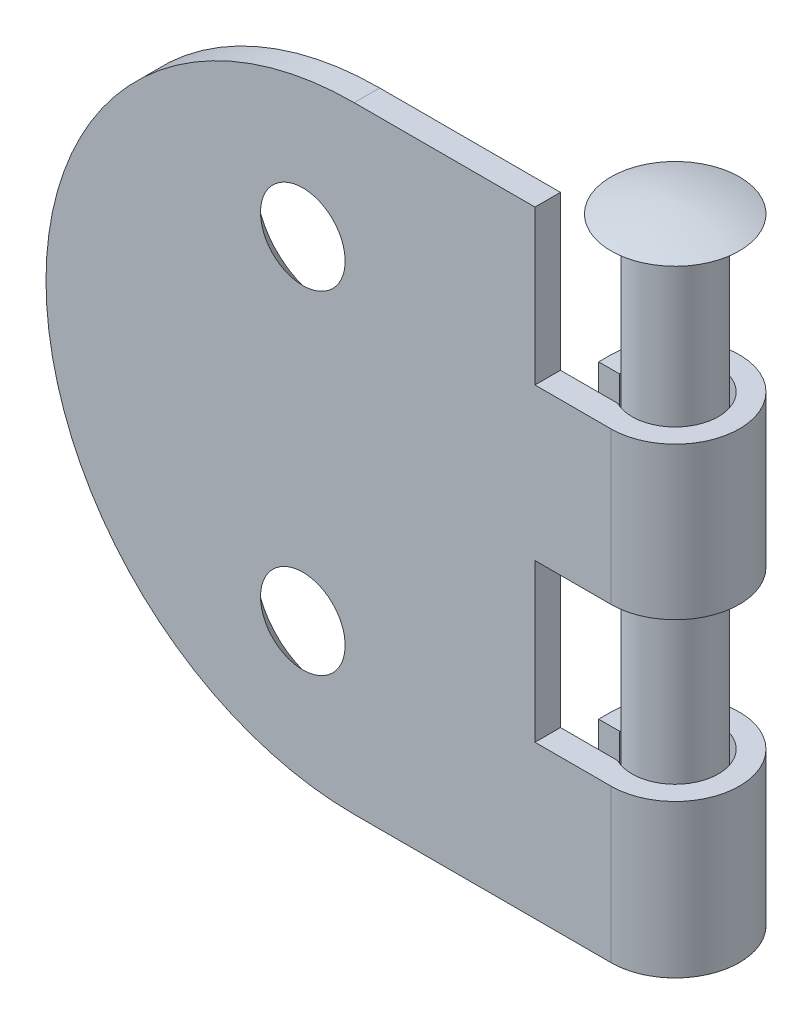
ISO-10303-21;
HEADER;
FILE_DESCRIPTION(('STEP AP214'),'2;1');
FILE_NAME('part.step','',(''),(''),'','','');
FILE_SCHEMA(('AUTOMOTIVE_DESIGN { 1 0 10303 214 1 1 1 1 }'));
ENDSEC;
DATA;
#1=APPLICATION_CONTEXT('core data for automotive mechanical design processes');
#2=APPLICATION_PROTOCOL_DEFINITION('international standard','automotive_design',2000,#1);
#3=PRODUCT_CONTEXT('',#1,'mechanical');
#4=PRODUCT('Part','Part','',(#3));
#5=PRODUCT_RELATED_PRODUCT_CATEGORY('part','',(#4));
#6=PRODUCT_DEFINITION_FORMATION('','',#4);
#7=PRODUCT_DEFINITION_CONTEXT('part definition',#1,'design');
#8=PRODUCT_DEFINITION('design','',#6,#7);
#9=PRODUCT_DEFINITION_SHAPE('','',#8);
#10=(LENGTH_UNIT() NAMED_UNIT(*) SI_UNIT(.MILLI.,.METRE.));
#11=(NAMED_UNIT(*) PLANE_ANGLE_UNIT() SI_UNIT($,.RADIAN.));
#12=(NAMED_UNIT(*) SI_UNIT($,.STERADIAN.) SOLID_ANGLE_UNIT());
#13=UNCERTAINTY_MEASURE_WITH_UNIT(LENGTH_MEASURE(1.E-05),#10,'distance_accuracy_value','');
#14=(GEOMETRIC_REPRESENTATION_CONTEXT(3) GLOBAL_UNCERTAINTY_ASSIGNED_CONTEXT((#13)) GLOBAL_UNIT_ASSIGNED_CONTEXT((#10,
#11,#12)) REPRESENTATION_CONTEXT('',''));
#15=CARTESIAN_POINT('',(0.,0.,0.));
#16=DIRECTION('',(0.,0.,1.));
#17=DIRECTION('',(1.,0.,0.));
#18=AXIS2_PLACEMENT_3D('',#15,#16,#17);
#19=CARTESIAN_POINT('',(-3.96875,21.2780334940602,0.));
#20=DIRECTION('',(1.,0.,0.));
#21=DIRECTION('',(0.,0.,-1.));
#22=AXIS2_PLACEMENT_3D('',#19,#20,#21);
#23=PLANE('',#22);
#24=DIRECTION('',(0.,0.,1.));
#25=VECTOR('',#24,1.);
#26=CARTESIAN_POINT('',(-3.96875,9.525,0.));
#27=LINE('',#26,#25);
#28=CARTESIAN_POINT('',(-3.96875,9.525,0.));
#29=VERTEX_POINT('',#28);
#30=CARTESIAN_POINT('',(-3.96875,9.525,0.762));
#31=VERTEX_POINT('',#30);
#32=EDGE_CURVE('E66',#29,#31,#27,.T.);
#33=ORIENTED_EDGE('',*,*,#32,.F.);
#34=DIRECTION('',(0.,-1.,0.));
#35=VECTOR('',#34,1.);
#36=CARTESIAN_POINT('',(-3.96875,21.2780334940602,0.));
#37=LINE('',#36,#35);
#38=CARTESIAN_POINT('',(-3.96875,0.127,0.));
#39=VERTEX_POINT('',#38);
#40=EDGE_CURVE('E75',#29,#39,#37,.T.);
#41=ORIENTED_EDGE('',*,*,#40,.T.);
#42=DIRECTION('',(0.,0.,1.));
#43=VECTOR('',#42,1.);
#44=CARTESIAN_POINT('',(-3.96875,0.127,0.));
#45=LINE('',#44,#43);
#46=CARTESIAN_POINT('',(-3.96875,0.127,0.762));
#47=VERTEX_POINT('',#46);
#48=EDGE_CURVE('E220',#39,#47,#45,.T.);
#49=ORIENTED_EDGE('',*,*,#48,.T.);
#50=DIRECTION('',(0.,-1.,0.));
#51=VECTOR('',#50,1.);
#52=CARTESIAN_POINT('',(-3.96875,21.2780334940602,0.762));
#53=LINE('',#52,#51);
#54=EDGE_CURVE('E203',#31,#47,#53,.T.);
#55=ORIENTED_EDGE('',*,*,#54,.F.);
#56=EDGE_LOOP('',(#33,#41,#49,#55));
#57=FACE_BOUND('',#56,.T.);
#58=ADVANCED_FACE('F56',(#57),#23,.F.);
#59=CARTESIAN_POINT('',(-2.667,21.2780334940602,0.762));
#60=DIRECTION('',(0.,0.,1.));
#61=DIRECTION('',(1.,0.,0.));
#62=AXIS2_PLACEMENT_3D('',#59,#60,#61);
#63=PLANE('',#62);
#64=DIRECTION('',(0.,-1.,0.));
#65=VECTOR('',#64,1.);
#66=CARTESIAN_POINT('',(-2.667,21.2780334940602,0.762));
#67=LINE('',#66,#65);
#68=CARTESIAN_POINT('',(-2.667,9.525,0.762));
#69=VERTEX_POINT('',#68);
#70=CARTESIAN_POINT('',(-2.667,0.127,0.762));
#71=VERTEX_POINT('',#70);
#72=EDGE_CURVE('E185',#69,#71,#67,.T.);
#73=ORIENTED_EDGE('',*,*,#72,.F.);
#74=DIRECTION('',(-1.,0.,0.));
#75=VECTOR('',#74,1.);
#76=CARTESIAN_POINT('',(-2.667,9.525,0.762));
#77=LINE('',#76,#75);
#78=EDGE_CURVE('E222',#69,#31,#77,.T.);
#79=ORIENTED_EDGE('',*,*,#78,.T.);
#80=ORIENTED_EDGE('',*,*,#54,.T.);
#81=DIRECTION('',(-1.,0.,0.));
#82=VECTOR('',#81,1.);
#83=CARTESIAN_POINT('',(-2.667,0.127,0.762));
#84=LINE('',#83,#82);
#85=EDGE_CURVE('E200',#71,#47,#84,.T.);
#86=ORIENTED_EDGE('',*,*,#85,.F.);
#87=EDGE_LOOP('',(#73,#79,#80,#86));
#88=FACE_BOUND('',#87,.T.);
#89=ADVANCED_FACE('F201',(#88),#63,.T.);
#90=CARTESIAN_POINT('',(-2.667,21.2780334940602,0.));
#91=DIRECTION('',(1.,0.,0.));
#92=DIRECTION('',(0.,0.,-1.));
#93=AXIS2_PLACEMENT_3D('',#90,#91,#92);
#94=PLANE('',#93);
#95=DIRECTION('',(0.,-1.,0.));
#96=VECTOR('',#95,1.);
#97=CARTESIAN_POINT('',(-2.667,21.2780334940602,0.));
#98=LINE('',#97,#96);
#99=CARTESIAN_POINT('',(-2.667,9.525,0.));
#100=VERTEX_POINT('',#99);
#101=CARTESIAN_POINT('',(-2.667,0.127,0.));
#102=VERTEX_POINT('',#101);
#103=EDGE_CURVE('E260',#100,#102,#98,.T.);
#104=ORIENTED_EDGE('',*,*,#103,.F.);
#105=DIRECTION('',(0.,0.,1.));
#106=VECTOR('',#105,1.);
#107=CARTESIAN_POINT('',(-2.667,9.525,0.));
#108=LINE('',#107,#106);
#109=EDGE_CURVE('E193',#100,#69,#108,.T.);
#110=ORIENTED_EDGE('',*,*,#109,.T.);
#111=ORIENTED_EDGE('',*,*,#72,.T.);
#112=DIRECTION('',(0.,0.,1.));
#113=VECTOR('',#112,1.);
#114=CARTESIAN_POINT('',(-2.667,0.127,0.));
#115=LINE('',#114,#113);
#116=EDGE_CURVE('E190',#102,#71,#115,.T.);
#117=ORIENTED_EDGE('',*,*,#116,.F.);
#118=EDGE_LOOP('',(#104,#110,#111,#117));
#119=FACE_BOUND('',#118,.T.);
#120=ADVANCED_FACE('F188',(#119),#94,.T.);
#121=CARTESIAN_POINT('',(0.,21.2780334940602,0.));
#122=DIRECTION('',(0.,-1.,0.));
#123=DIRECTION('',(0.,0.,-1.));
#124=AXIS2_PLACEMENT_3D('',#121,#122,#123);
#125=CYLINDRICAL_SURFACE('',#124,2.667);
#126=DIRECTION('',(0.,-1.,0.));
#127=VECTOR('',#126,1.);
#128=CARTESIAN_POINT('',(-1.17553919436997,21.2780334940602,2.39395));
#129=LINE('',#128,#127);
#130=CARTESIAN_POINT('',(-1.17553919436997,9.525,2.39395));
#131=VERTEX_POINT('',#130);
#132=CARTESIAN_POINT('',(-1.17553919436997,0.127,2.39395));
#133=VERTEX_POINT('',#132);
#134=EDGE_CURVE('E231',#131,#133,#129,.T.);
#135=ORIENTED_EDGE('',*,*,#134,.F.);
#136=CARTESIAN_POINT('',(0.,9.525,0.));
#137=DIRECTION('',(0.,1.,0.));
#138=DIRECTION('',(0.,0.,1.));
#139=AXIS2_PLACEMENT_3D('',#136,#137,#138);
#140=CIRCLE('',#139,2.667);
#141=EDGE_CURVE('E196',#131,#100,#140,.T.);
#142=ORIENTED_EDGE('',*,*,#141,.T.);
#143=ORIENTED_EDGE('',*,*,#103,.T.);
#144=CARTESIAN_POINT('',(0.,0.127,0.));
#145=DIRECTION('',(0.,1.,0.));
#146=DIRECTION('',(0.,0.,1.));
#147=AXIS2_PLACEMENT_3D('',#144,#145,#146);
#148=CIRCLE('',#147,2.667);
#149=EDGE_CURVE('E212',#133,#102,#148,.T.);
#150=ORIENTED_EDGE('',*,*,#149,.F.);
#151=EDGE_LOOP('',(#135,#142,#143,#150));
#152=FACE_BOUND('',#151,.T.);
#153=ADVANCED_FACE('F417',(#152),#125,.F.);
#154=CARTESIAN_POINT('',(0.,21.2780334940602,2.39395));
#155=DIRECTION('',(0.,0.,-1.));
#156=DIRECTION('',(-1.,0.,0.));
#157=AXIS2_PLACEMENT_3D('',#154,#155,#156);
#158=PLANE('',#157);
#159=CARTESIAN_POINT('',(-19.05,10.287,2.39395));
#160=DIRECTION('',(0.,0.,-1.));
#161=DIRECTION('',(-1.,0.,0.));
#162=AXIS2_PLACEMENT_3D('',#159,#160,#161);
#163=CIRCLE('',#162,4.49259581845785);
#164=CARTESIAN_POINT('',(-23.5425958184579,10.287,2.39395));
#165=VERTEX_POINT('',#164);
#166=EDGE_CURVE('E368',#165,#165,#163,.T.);
#167=ORIENTED_EDGE('',*,*,#166,.F.);
#168=EDGE_LOOP('',(#167));
#169=FACE_BOUND('',#168,.T.);
#170=CARTESIAN_POINT('',(-19.05,-10.287,2.39395));
#171=DIRECTION('',(0.,0.,-1.));
#172=DIRECTION('',(-1.,0.,0.));
#173=AXIS2_PLACEMENT_3D('',#170,#171,#172);
#174=CIRCLE('',#173,4.49259581845785);
#175=CARTESIAN_POINT('',(-23.5425958184579,-10.287,2.39395));
#176=VERTEX_POINT('',#175);
#177=EDGE_CURVE('E372',#176,#176,#174,.T.);
#178=ORIENTED_EDGE('',*,*,#177,.F.);
#179=EDGE_LOOP('',(#178));
#180=FACE_BOUND('',#179,.T.);
#181=DIRECTION('',(1.,0.,0.));
#182=VECTOR('',#181,1.);
#183=CARTESIAN_POINT('',(0.,0.126999999999999,2.39395));
#184=LINE('',#183,#182);
#185=CARTESIAN_POINT('',(-4.699,0.127,2.39395));
#186=VERTEX_POINT('',#185);
#187=EDGE_CURVE('E214',#186,#133,#184,.T.);
#188=ORIENTED_EDGE('',*,*,#187,.F.);
#189=DIRECTION('',(0.,1.,0.));
#190=VECTOR('',#189,1.);
#191=CARTESIAN_POINT('',(-4.699,-19.05,2.39395));
#192=LINE('',#191,#190);
#193=CARTESIAN_POINT('',(-4.699,-9.6012,2.39395));
#194=VERTEX_POINT('',#193);
#195=EDGE_CURVE('E60',#194,#186,#192,.T.);
#196=ORIENTED_EDGE('',*,*,#195,.F.);
#197=DIRECTION('',(1.,0.,0.));
#198=VECTOR('',#197,1.);
#199=CARTESIAN_POINT('',(0.,-9.6012,2.39395));
#200=LINE('',#199,#198);
#201=CARTESIAN_POINT('',(-1.17553919436997,-9.6012,2.39395));
#202=VERTEX_POINT('',#201);
#203=EDGE_CURVE('E117',#194,#202,#200,.T.);
#204=ORIENTED_EDGE('',*,*,#203,.T.);
#205=DIRECTION('',(0.,-1.,0.));
#206=VECTOR('',#205,1.);
#207=CARTESIAN_POINT('',(-1.17553919436997,2.22803349406016,2.39395));
#208=LINE('',#207,#206);
#209=CARTESIAN_POINT('',(-1.17553919436997,-19.05,2.39395));
#210=VERTEX_POINT('',#209);
#211=EDGE_CURVE('E283',#202,#210,#208,.T.);
#212=ORIENTED_EDGE('',*,*,#211,.T.);
#213=DIRECTION('',(1.,0.,0.));
#214=VECTOR('',#213,1.);
#215=CARTESIAN_POINT('',(-15.875,-19.05,2.39395));
#216=LINE('',#215,#214);
#217=CARTESIAN_POINT('',(-15.875,-19.05,2.39395));
#218=VERTEX_POINT('',#217);
#219=EDGE_CURVE('E289',#218,#210,#216,.T.);
#220=ORIENTED_EDGE('',*,*,#219,.F.);
#221=CARTESIAN_POINT('',(-15.875,0.,2.39395));
#222=DIRECTION('',(0.,0.,-1.));
#223=DIRECTION('',(-1.,0.,0.));
#224=AXIS2_PLACEMENT_3D('',#221,#222,#223);
#225=CIRCLE('',#224,19.05);
#226=CARTESIAN_POINT('',(-15.875,19.05,2.39395));
#227=VERTEX_POINT('',#226);
#228=EDGE_CURVE('E351',#227,#218,#225,.F.);
#229=ORIENTED_EDGE('',*,*,#228,.F.);
#230=DIRECTION('',(-1.,0.,0.));
#231=VECTOR('',#230,1.);
#232=CARTESIAN_POINT('',(-4.69900000000001,19.05,2.39395));
#233=LINE('',#232,#231);
#234=CARTESIAN_POINT('',(-4.69900000000001,19.05,2.39395));
#235=VERTEX_POINT('',#234);
#236=EDGE_CURVE('E342',#235,#227,#233,.T.);
#237=ORIENTED_EDGE('',*,*,#236,.F.);
#238=DIRECTION('',(0.,1.,0.));
#239=VECTOR('',#238,1.);
#240=CARTESIAN_POINT('',(-4.699,-19.05,2.39395));
#241=LINE('',#240,#239);
#242=CARTESIAN_POINT('',(-4.699,9.525,2.39395));
#243=VERTEX_POINT('',#242);
#244=EDGE_CURVE('E333',#243,#235,#241,.T.);
#245=ORIENTED_EDGE('',*,*,#244,.F.);
#246=DIRECTION('',(1.,0.,0.));
#247=VECTOR('',#246,1.);
#248=CARTESIAN_POINT('',(0.,9.525,2.39395));
#249=LINE('',#248,#247);
#250=EDGE_CURVE('E346',#243,#131,#249,.T.);
#251=ORIENTED_EDGE('',*,*,#250,.T.);
#252=ORIENTED_EDGE('',*,*,#134,.T.);
#253=EDGE_LOOP('',(#188,#196,#204,#212,#220,#229,#237,#245,#251,#252));
#254=FACE_BOUND('',#253,.T.);
#255=ADVANCED_FACE('F58',(#169,#180,#254),#158,.T.);
#256=CARTESIAN_POINT('',(0.,21.2780334940602,3.96875));
#257=DIRECTION('',(0.,0.,-1.));
#258=DIRECTION('',(-1.,0.,0.));
#259=AXIS2_PLACEMENT_3D('',#256,#257,#258);
#260=PLANE('',#259);
#261=CARTESIAN_POINT('',(-19.05,10.287,3.96875));
#262=DIRECTION('',(0.,0.,-1.));
#263=DIRECTION('',(-1.,0.,0.));
#264=AXIS2_PLACEMENT_3D('',#261,#262,#263);
#265=CIRCLE('',#264,2.61582226084048);
#266=CARTESIAN_POINT('',(-21.6658222608405,10.287,3.96875));
#267=VERTEX_POINT('',#266);
#268=EDGE_CURVE('E371',#267,#267,#265,.T.);
#269=ORIENTED_EDGE('',*,*,#268,.T.);
#270=EDGE_LOOP('',(#269));
#271=FACE_BOUND('',#270,.T.);
#272=CARTESIAN_POINT('',(-19.05,-10.287,3.96875));
#273=DIRECTION('',(0.,0.,-1.));
#274=DIRECTION('',(-1.,0.,0.));
#275=AXIS2_PLACEMENT_3D('',#272,#273,#274);
#276=CIRCLE('',#275,2.61582226084048);
#277=CARTESIAN_POINT('',(-21.6658222608405,-10.287,3.96875));
#278=VERTEX_POINT('',#277);
#279=EDGE_CURVE('E238',#278,#278,#276,.T.);
#280=ORIENTED_EDGE('',*,*,#279,.T.);
#281=EDGE_LOOP('',(#280));
#282=FACE_BOUND('',#281,.T.);
#283=DIRECTION('',(1.,0.,0.));
#284=VECTOR('',#283,1.);
#285=CARTESIAN_POINT('',(0.,9.525,3.96875));
#286=LINE('',#285,#284);
#287=CARTESIAN_POINT('',(-4.699,9.525,3.96875));
#288=VERTEX_POINT('',#287);
#289=CARTESIAN_POINT('',(0.,9.525,3.96875));
#290=VERTEX_POINT('',#289);
#291=EDGE_CURVE('E15',#288,#290,#286,.T.);
#292=ORIENTED_EDGE('',*,*,#291,.F.);
#293=DIRECTION('',(0.,1.,0.));
#294=VECTOR('',#293,1.);
#295=CARTESIAN_POINT('',(-4.699,-19.05,3.96875));
#296=LINE('',#295,#294);
#297=CARTESIAN_POINT('',(-4.69900000000001,19.05,3.96875));
#298=VERTEX_POINT('',#297);
#299=EDGE_CURVE('E237',#288,#298,#296,.T.);
#300=ORIENTED_EDGE('',*,*,#299,.T.);
#301=DIRECTION('',(-1.,0.,0.));
#302=VECTOR('',#301,1.);
#303=CARTESIAN_POINT('',(-4.69900000000001,19.05,3.96875));
#304=LINE('',#303,#302);
#305=CARTESIAN_POINT('',(-15.875,19.05,3.96875));
#306=VERTEX_POINT('',#305);
#307=EDGE_CURVE('E236',#298,#306,#304,.T.);
#308=ORIENTED_EDGE('',*,*,#307,.T.);
#309=CARTESIAN_POINT('',(-15.875,0.,3.96875));
#310=DIRECTION('',(0.,0.,1.));
#311=DIRECTION('',(1.,0.,0.));
#312=AXIS2_PLACEMENT_3D('',#309,#310,#311);
#313=CIRCLE('',#312,19.05);
#314=CARTESIAN_POINT('',(-15.875,-19.05,3.96875));
#315=VERTEX_POINT('',#314);
#316=EDGE_CURVE('E261',#306,#315,#313,.T.);
#317=ORIENTED_EDGE('',*,*,#316,.T.);
#318=DIRECTION('',(1.,0.,0.));
#319=VECTOR('',#318,1.);
#320=CARTESIAN_POINT('',(-15.875,-19.05,3.96875));
#321=LINE('',#320,#319);
#322=CARTESIAN_POINT('',(0.,-19.05,3.96875));
#323=VERTEX_POINT('',#322);
#324=EDGE_CURVE('E244',#315,#323,#321,.T.);
#325=ORIENTED_EDGE('',*,*,#324,.T.);
#326=DIRECTION('',(0.,-1.,0.));
#327=VECTOR('',#326,1.);
#328=CARTESIAN_POINT('',(0.,2.22803349406016,3.96875));
#329=LINE('',#328,#327);
#330=CARTESIAN_POINT('',(0.,-9.6012,3.96875));
#331=VERTEX_POINT('',#330);
#332=EDGE_CURVE('E280',#331,#323,#329,.T.);
#333=ORIENTED_EDGE('',*,*,#332,.F.);
#334=DIRECTION('',(1.,0.,0.));
#335=VECTOR('',#334,1.);
#336=CARTESIAN_POINT('',(0.,-9.6012,3.96875));
#337=LINE('',#336,#335);
#338=CARTESIAN_POINT('',(-4.699,-9.6012,3.96875));
#339=VERTEX_POINT('',#338);
#340=EDGE_CURVE('E126',#339,#331,#337,.T.);
#341=ORIENTED_EDGE('',*,*,#340,.F.);
#342=CARTESIAN_POINT('',(-4.699,0.126999999999999,3.96875));
#343=VERTEX_POINT('',#342);
#344=EDGE_CURVE('E233',#339,#343,#296,.T.);
#345=ORIENTED_EDGE('',*,*,#344,.T.);
#346=DIRECTION('',(-1.,0.,0.));
#347=VECTOR('',#346,1.);
#348=CARTESIAN_POINT('',(0.,0.127,3.96875));
#349=LINE('',#348,#347);
#350=CARTESIAN_POINT('',(0.,0.127,3.96875));
#351=VERTEX_POINT('',#350);
#352=EDGE_CURVE('E230',#343,#351,#349,.F.);
#353=ORIENTED_EDGE('',*,*,#352,.T.);
#354=DIRECTION('',(0.,-1.,0.));
#355=VECTOR('',#354,1.);
#356=CARTESIAN_POINT('',(0.,21.2780334940602,3.96875));
#357=LINE('',#356,#355);
#358=EDGE_CURVE('E251',#290,#351,#357,.T.);
#359=ORIENTED_EDGE('',*,*,#358,.F.);
#360=EDGE_LOOP('',(#292,#300,#308,#317,#325,#333,#341,#345,#353,#359));
#361=FACE_BOUND('',#360,.T.);
#362=ADVANCED_FACE('F327',(#271,#282,#361),#260,.F.);
#363=CARTESIAN_POINT('',(0.,21.2780334940602,0.));
#364=DIRECTION('',(0.,-1.,0.));
#365=DIRECTION('',(0.,0.,-1.));
#366=AXIS2_PLACEMENT_3D('',#363,#364,#365);
#367=CYLINDRICAL_SURFACE('',#366,3.96875);
#368=CARTESIAN_POINT('',(0.,9.525,0.));
#369=DIRECTION('',(0.,1.,0.));
#370=DIRECTION('',(0.,0.,1.));
#371=AXIS2_PLACEMENT_3D('',#368,#369,#370);
#372=CIRCLE('',#371,3.96875);
#373=EDGE_CURVE('E207',#290,#29,#372,.T.);
#374=ORIENTED_EDGE('',*,*,#373,.F.);
#375=ORIENTED_EDGE('',*,*,#358,.T.);
#376=CARTESIAN_POINT('',(0.,0.127,0.));
#377=DIRECTION('',(0.,1.,0.));
#378=DIRECTION('',(-1.,0.,0.));
#379=AXIS2_PLACEMENT_3D('',#376,#377,#378);
#380=CIRCLE('',#379,3.96875);
#381=EDGE_CURVE('E249',#351,#39,#380,.T.);
#382=ORIENTED_EDGE('',*,*,#381,.T.);
#383=ORIENTED_EDGE('',*,*,#40,.F.);
#384=EDGE_LOOP('',(#374,#375,#382,#383));
#385=FACE_BOUND('',#384,.T.);
#386=ADVANCED_FACE('F422',(#385),#367,.T.);
#387=CARTESIAN_POINT('',(0.,0.127,0.));
#388=DIRECTION('',(0.,1.,0.));
#389=DIRECTION('',(0.,0.,1.));
#390=AXIS2_PLACEMENT_3D('',#387,#388,#389);
#391=PLANE('',#390);
#392=ORIENTED_EDGE('',*,*,#48,.F.);
#393=ORIENTED_EDGE('',*,*,#381,.F.);
#394=ORIENTED_EDGE('',*,*,#352,.F.);
#395=DIRECTION('',(0.,0.,-1.));
#396=VECTOR('',#395,1.);
#397=CARTESIAN_POINT('',(-4.699,0.127,3.96875));
#398=LINE('',#397,#396);
#399=EDGE_CURVE('E250',#343,#186,#398,.T.);
#400=ORIENTED_EDGE('',*,*,#399,.T.);
#401=ORIENTED_EDGE('',*,*,#187,.T.);
#402=ORIENTED_EDGE('',*,*,#149,.T.);
#403=ORIENTED_EDGE('',*,*,#116,.T.);
#404=ORIENTED_EDGE('',*,*,#85,.T.);
#405=EDGE_LOOP('',(#392,#393,#394,#400,#401,#402,#403,#404));
#406=FACE_BOUND('',#405,.T.);
#407=ADVANCED_FACE('F209',(#406),#391,.F.);
#408=CARTESIAN_POINT('',(0.,9.525,0.));
#409=DIRECTION('',(0.,1.,0.));
#410=DIRECTION('',(0.,0.,1.));
#411=AXIS2_PLACEMENT_3D('',#408,#409,#410);
#412=PLANE('',#411);
#413=ORIENTED_EDGE('',*,*,#373,.T.);
#414=ORIENTED_EDGE('',*,*,#32,.T.);
#415=ORIENTED_EDGE('',*,*,#78,.F.);
#416=ORIENTED_EDGE('',*,*,#109,.F.);
#417=ORIENTED_EDGE('',*,*,#141,.F.);
#418=ORIENTED_EDGE('',*,*,#250,.F.);
#419=DIRECTION('',(0.,0.,-1.));
#420=VECTOR('',#419,1.);
#421=CARTESIAN_POINT('',(-4.699,9.525,3.96875));
#422=LINE('',#421,#420);
#423=EDGE_CURVE('E227',#288,#243,#422,.T.);
#424=ORIENTED_EDGE('',*,*,#423,.F.);
#425=ORIENTED_EDGE('',*,*,#291,.T.);
#426=EDGE_LOOP('',(#413,#414,#415,#416,#417,#418,#424,#425));
#427=FACE_BOUND('',#426,.T.);
#428=ADVANCED_FACE('F389',(#427),#412,.T.);
#429=CARTESIAN_POINT('',(-4.699,-19.05,-45.9665385922102));
#430=DIRECTION('',(1.,0.,0.));
#431=DIRECTION('',(0.,1.,0.));
#432=AXIS2_PLACEMENT_3D('',#429,#430,#431);
#433=PLANE('',#432);
#434=DIRECTION('',(0.,0.,1.));
#435=VECTOR('',#434,1.);
#436=CARTESIAN_POINT('',(-4.699,-9.6012,2.667));
#437=LINE('',#436,#435);
#438=EDGE_CURVE('E293',#194,#339,#437,.T.);
#439=ORIENTED_EDGE('',*,*,#438,.F.);
#440=ORIENTED_EDGE('',*,*,#195,.T.);
#441=ORIENTED_EDGE('',*,*,#399,.F.);
#442=ORIENTED_EDGE('',*,*,#344,.F.);
#443=EDGE_LOOP('',(#439,#440,#441,#442));
#444=FACE_BOUND('',#443,.T.);
#445=ADVANCED_FACE('F396',(#444),#433,.T.);
#446=CARTESIAN_POINT('',(-15.875,-19.05,-45.9665385922102));
#447=DIRECTION('',(0.,-1.,0.));
#448=DIRECTION('',(0.,0.,-1.));
#449=AXIS2_PLACEMENT_3D('',#446,#447,#448);
#450=PLANE('',#449);
#451=DIRECTION('',(0.,0.,1.));
#452=VECTOR('',#451,1.);
#453=CARTESIAN_POINT('',(-15.875,-19.05,-45.9665385922102));
#454=LINE('',#453,#452);
#455=EDGE_CURVE('E350',#218,#315,#454,.T.);
#456=ORIENTED_EDGE('',*,*,#455,.F.);
#457=ORIENTED_EDGE('',*,*,#219,.T.);
#458=CARTESIAN_POINT('',(0.,-19.05,0.));
#459=DIRECTION('',(0.,1.,0.));
#460=DIRECTION('',(0.,0.,-1.));
#461=AXIS2_PLACEMENT_3D('',#458,#459,#460);
#462=CIRCLE('',#461,2.667);
#463=CARTESIAN_POINT('',(-2.667,-19.05,0.));
#464=VERTEX_POINT('',#463);
#465=EDGE_CURVE('E295',#210,#464,#462,.T.);
#466=ORIENTED_EDGE('',*,*,#465,.T.);
#467=DIRECTION('',(0.,0.,1.));
#468=VECTOR('',#467,1.);
#469=CARTESIAN_POINT('',(-2.667,-19.05,0.));
#470=LINE('',#469,#468);
#471=CARTESIAN_POINT('',(-2.667,-19.05,0.762));
#472=VERTEX_POINT('',#471);
#473=EDGE_CURVE('E302',#464,#472,#470,.T.);
#474=ORIENTED_EDGE('',*,*,#473,.T.);
#475=DIRECTION('',(1.,0.,0.));
#476=VECTOR('',#475,1.);
#477=CARTESIAN_POINT('',(-3.96875,-19.05,0.762));
#478=LINE('',#477,#476);
#479=CARTESIAN_POINT('',(-3.96875,-19.05,0.762));
#480=VERTEX_POINT('',#479);
#481=EDGE_CURVE('E275',#480,#472,#478,.T.);
#482=ORIENTED_EDGE('',*,*,#481,.F.);
#483=DIRECTION('',(0.,0.,1.));
#484=VECTOR('',#483,1.);
#485=CARTESIAN_POINT('',(-3.96875,-19.05,0.));
#486=LINE('',#485,#484);
#487=CARTESIAN_POINT('',(-3.96875,-19.05,0.));
#488=VERTEX_POINT('',#487);
#489=EDGE_CURVE('E276',#488,#480,#486,.T.);
#490=ORIENTED_EDGE('',*,*,#489,.F.);
#491=CARTESIAN_POINT('',(0.,-19.05,0.));
#492=DIRECTION('',(0.,-1.,0.));
#493=DIRECTION('',(1.,0.,0.));
#494=AXIS2_PLACEMENT_3D('',#491,#492,#493);
#495=CIRCLE('',#494,3.96875);
#496=EDGE_CURVE('E279',#323,#488,#495,.F.);
#497=ORIENTED_EDGE('',*,*,#496,.F.);
#498=ORIENTED_EDGE('',*,*,#324,.F.);
#499=EDGE_LOOP('',(#456,#457,#466,#474,#482,#490,#497,#498));
#500=FACE_BOUND('',#499,.T.);
#501=ADVANCED_FACE('F319',(#500),#450,.T.);
#502=CARTESIAN_POINT('',(-15.875,0.,-45.9665385922102));
#503=DIRECTION('',(0.,0.,1.));
#504=DIRECTION('',(1.,0.,0.));
#505=AXIS2_PLACEMENT_3D('',#502,#503,#504);
#506=CYLINDRICAL_SURFACE('',#505,19.05);
#507=DIRECTION('',(0.,0.,1.));
#508=VECTOR('',#507,1.);
#509=CARTESIAN_POINT('',(-15.875,19.05,-45.9665385922102));
#510=LINE('',#509,#508);
#511=EDGE_CURVE('E338',#227,#306,#510,.T.);
#512=ORIENTED_EDGE('',*,*,#511,.F.);
#513=ORIENTED_EDGE('',*,*,#228,.T.);
#514=ORIENTED_EDGE('',*,*,#455,.T.);
#515=ORIENTED_EDGE('',*,*,#316,.F.);
#516=EDGE_LOOP('',(#512,#513,#514,#515));
#517=FACE_BOUND('',#516,.T.);
#518=ADVANCED_FACE('F382',(#517),#506,.T.);
#519=CARTESIAN_POINT('',(-4.69900000000001,19.05,-45.9665385922102));
#520=DIRECTION('',(0.,1.,0.));
#521=DIRECTION('',(-1.,0.,0.));
#522=AXIS2_PLACEMENT_3D('',#519,#520,#521);
#523=PLANE('',#522);
#524=DIRECTION('',(0.,0.,1.));
#525=VECTOR('',#524,1.);
#526=CARTESIAN_POINT('',(-4.69900000000001,19.05,-45.9665385922102));
#527=LINE('',#526,#525);
#528=EDGE_CURVE('E248',#235,#298,#527,.T.);
#529=ORIENTED_EDGE('',*,*,#528,.F.);
#530=ORIENTED_EDGE('',*,*,#236,.T.);
#531=ORIENTED_EDGE('',*,*,#511,.T.);
#532=ORIENTED_EDGE('',*,*,#307,.F.);
#533=EDGE_LOOP('',(#529,#530,#531,#532));
#534=FACE_BOUND('',#533,.T.);
#535=ADVANCED_FACE('F384',(#534),#523,.T.);
#536=ORIENTED_EDGE('',*,*,#299,.F.);
#537=ORIENTED_EDGE('',*,*,#423,.T.);
#538=ORIENTED_EDGE('',*,*,#244,.T.);
#539=ORIENTED_EDGE('',*,*,#528,.T.);
#540=EDGE_LOOP('',(#536,#537,#538,#539));
#541=FACE_BOUND('',#540,.T.);
#542=ADVANCED_FACE('F386',(#541),#433,.T.);
#543=CARTESIAN_POINT('',(-2.667,2.22803349406016,0.));
#544=DIRECTION('',(1.,0.,0.));
#545=DIRECTION('',(0.,0.,-1.));
#546=AXIS2_PLACEMENT_3D('',#543,#544,#545);
#547=PLANE('',#546);
#548=DIRECTION('',(0.,-1.,0.));
#549=VECTOR('',#548,1.);
#550=CARTESIAN_POINT('',(-2.667,2.22803349406016,0.));
#551=LINE('',#550,#549);
#552=CARTESIAN_POINT('',(-2.667,-9.6012,0.));
#553=VERTEX_POINT('',#552);
#554=EDGE_CURVE('E284',#553,#464,#551,.T.);
#555=ORIENTED_EDGE('',*,*,#554,.F.);
#556=DIRECTION('',(0.,0.,1.));
#557=VECTOR('',#556,1.);
#558=CARTESIAN_POINT('',(-2.667,-9.6012,0.));
#559=LINE('',#558,#557);
#560=CARTESIAN_POINT('',(-2.667,-9.6012,0.762));
#561=VERTEX_POINT('',#560);
#562=EDGE_CURVE('E272',#553,#561,#559,.T.);
#563=ORIENTED_EDGE('',*,*,#562,.T.);
#564=DIRECTION('',(0.,-1.,0.));
#565=VECTOR('',#564,1.);
#566=CARTESIAN_POINT('',(-2.667,2.22803349406016,0.762));
#567=LINE('',#566,#565);
#568=EDGE_CURVE('E269',#561,#472,#567,.T.);
#569=ORIENTED_EDGE('',*,*,#568,.T.);
#570=ORIENTED_EDGE('',*,*,#473,.F.);
#571=EDGE_LOOP('',(#555,#563,#569,#570));
#572=FACE_BOUND('',#571,.T.);
#573=ADVANCED_FACE('F407',(#572),#547,.T.);
#574=CARTESIAN_POINT('',(0.,2.22803349406016,0.));
#575=DIRECTION('',(0.,-1.,0.));
#576=DIRECTION('',(0.,0.,-1.));
#577=AXIS2_PLACEMENT_3D('',#574,#575,#576);
#578=CYLINDRICAL_SURFACE('',#577,2.667);
#579=ORIENTED_EDGE('',*,*,#211,.F.);
#580=CARTESIAN_POINT('',(0.,-9.6012,0.));
#581=DIRECTION('',(0.,1.,0.));
#582=DIRECTION('',(0.,0.,1.));
#583=AXIS2_PLACEMENT_3D('',#580,#581,#582);
#584=CIRCLE('',#583,2.667);
#585=EDGE_CURVE('E271',#202,#553,#584,.T.);
#586=ORIENTED_EDGE('',*,*,#585,.T.);
#587=ORIENTED_EDGE('',*,*,#554,.T.);
#588=ORIENTED_EDGE('',*,*,#465,.F.);
#589=EDGE_LOOP('',(#579,#586,#587,#588));
#590=FACE_BOUND('',#589,.T.);
#591=ADVANCED_FACE('F361',(#590),#578,.F.);
#592=CARTESIAN_POINT('',(0.,2.22803349406016,0.));
#593=DIRECTION('',(0.,-1.,0.));
#594=DIRECTION('',(0.,0.,-1.));
#595=AXIS2_PLACEMENT_3D('',#592,#593,#594);
#596=CYLINDRICAL_SURFACE('',#595,3.96875);
#597=CARTESIAN_POINT('',(0.,-9.6012,0.));
#598=DIRECTION('',(0.,1.,0.));
#599=DIRECTION('',(0.,0.,1.));
#600=AXIS2_PLACEMENT_3D('',#597,#598,#599);
#601=CIRCLE('',#600,3.96875);
#602=CARTESIAN_POINT('',(-3.96875,-9.6012,0.));
#603=VERTEX_POINT('',#602);
#604=EDGE_CURVE('E297',#331,#603,#601,.T.);
#605=ORIENTED_EDGE('',*,*,#604,.F.);
#606=ORIENTED_EDGE('',*,*,#332,.T.);
#607=ORIENTED_EDGE('',*,*,#496,.T.);
#608=DIRECTION('',(0.,-1.,0.));
#609=VECTOR('',#608,1.);
#610=CARTESIAN_POINT('',(-3.96875,2.22803349406016,0.));
#611=LINE('',#610,#609);
#612=EDGE_CURVE('E277',#603,#488,#611,.T.);
#613=ORIENTED_EDGE('',*,*,#612,.F.);
#614=EDGE_LOOP('',(#605,#606,#607,#613));
#615=FACE_BOUND('',#614,.T.);
#616=ADVANCED_FACE('F314',(#615),#596,.T.);
#617=CARTESIAN_POINT('',(-3.96875,2.22803349406016,0.));
#618=DIRECTION('',(1.,0.,0.));
#619=DIRECTION('',(0.,0.,-1.));
#620=AXIS2_PLACEMENT_3D('',#617,#618,#619);
#621=PLANE('',#620);
#622=DIRECTION('',(0.,0.,1.));
#623=VECTOR('',#622,1.);
#624=CARTESIAN_POINT('',(-3.96875,-9.6012,0.));
#625=LINE('',#624,#623);
#626=CARTESIAN_POINT('',(-3.96875,-9.6012,0.762));
#627=VERTEX_POINT('',#626);
#628=EDGE_CURVE('E290',#603,#627,#625,.T.);
#629=ORIENTED_EDGE('',*,*,#628,.F.);
#630=ORIENTED_EDGE('',*,*,#612,.T.);
#631=ORIENTED_EDGE('',*,*,#489,.T.);
#632=DIRECTION('',(0.,-1.,0.));
#633=VECTOR('',#632,1.);
#634=CARTESIAN_POINT('',(-3.96875,2.22803349406016,0.762));
#635=LINE('',#634,#633);
#636=EDGE_CURVE('E273',#627,#480,#635,.T.);
#637=ORIENTED_EDGE('',*,*,#636,.F.);
#638=EDGE_LOOP('',(#629,#630,#631,#637));
#639=FACE_BOUND('',#638,.T.);
#640=ADVANCED_FACE('F322',(#639),#621,.F.);
#641=CARTESIAN_POINT('',(-3.96875,2.22803349406016,0.762));
#642=DIRECTION('',(0.,0.,-1.));
#643=DIRECTION('',(-1.,0.,0.));
#644=AXIS2_PLACEMENT_3D('',#641,#642,#643);
#645=PLANE('',#644);
#646=DIRECTION('',(1.,0.,0.));
#647=VECTOR('',#646,1.);
#648=CARTESIAN_POINT('',(-3.96875,-9.6012,0.762));
#649=LINE('',#648,#647);
#650=EDGE_CURVE('E286',#627,#561,#649,.T.);
#651=ORIENTED_EDGE('',*,*,#650,.F.);
#652=ORIENTED_EDGE('',*,*,#636,.T.);
#653=ORIENTED_EDGE('',*,*,#481,.T.);
#654=ORIENTED_EDGE('',*,*,#568,.F.);
#655=EDGE_LOOP('',(#651,#652,#653,#654));
#656=FACE_BOUND('',#655,.T.);
#657=ADVANCED_FACE('F465',(#656),#645,.F.);
#658=CARTESIAN_POINT('',(0.,-9.6012,0.));
#659=DIRECTION('',(0.,1.,0.));
#660=DIRECTION('',(0.,0.,1.));
#661=AXIS2_PLACEMENT_3D('',#658,#659,#660);
#662=PLANE('',#661);
#663=ORIENTED_EDGE('',*,*,#562,.F.);
#664=ORIENTED_EDGE('',*,*,#585,.F.);
#665=ORIENTED_EDGE('',*,*,#203,.F.);
#666=ORIENTED_EDGE('',*,*,#438,.T.);
#667=ORIENTED_EDGE('',*,*,#340,.T.);
#668=ORIENTED_EDGE('',*,*,#604,.T.);
#669=ORIENTED_EDGE('',*,*,#628,.T.);
#670=ORIENTED_EDGE('',*,*,#650,.T.);
#671=EDGE_LOOP('',(#663,#664,#665,#666,#667,#668,#669,#670));
#672=FACE_BOUND('',#671,.T.);
#673=ADVANCED_FACE('F325',(#672),#662,.T.);
#674=CARTESIAN_POINT('',(-19.05,-10.287,2.667));
#675=DIRECTION('',(0.,0.,-1.));
#676=DIRECTION('',(-1.,0.,0.));
#677=AXIS2_PLACEMENT_3D('',#674,#675,#676);
#678=CONICAL_SURFACE('',#677,4.1671875,0.872664625997167);
#679=ORIENTED_EDGE('',*,*,#177,.T.);
#680=EDGE_LOOP('',(#679));
#681=FACE_BOUND('',#680,.T.);
#682=ORIENTED_EDGE('',*,*,#279,.F.);
#683=EDGE_LOOP('',(#682));
#684=FACE_BOUND('',#683,.T.);
#685=ADVANCED_FACE('F479',(#681,#684),#678,.F.);
#686=CARTESIAN_POINT('',(-19.05,10.287,2.667));
#687=DIRECTION('',(0.,0.,-1.));
#688=DIRECTION('',(-1.,0.,0.));
#689=AXIS2_PLACEMENT_3D('',#686,#687,#688);
#690=CONICAL_SURFACE('',#689,4.1671875,0.872664625997167);
#691=ORIENTED_EDGE('',*,*,#166,.T.);
#692=EDGE_LOOP('',(#691));
#693=FACE_BOUND('',#692,.T.);
#694=ORIENTED_EDGE('',*,*,#268,.F.);
#695=EDGE_LOOP('',(#694));
#696=FACE_BOUND('',#695,.T.);
#697=ADVANCED_FACE('F485',(#693,#696),#690,.F.);
#698=CLOSED_SHELL('',(#58,#89,#120,#153,#255,#362,#386,#407,#428,#445,#501,#518,#535,#542,#573,
#591,#616,#640,#657,#673,#685,#697));
#699=MANIFOLD_SOLID_BREP('B2',#698);
#700=CARTESIAN_POINT('',(0.,-19.05,0.));
#701=DIRECTION('',(0.,1.,0.));
#702=DIRECTION('',(0.,0.,1.));
#703=AXIS2_PLACEMENT_3D('',#700,#701,#702);
#704=CYLINDRICAL_SURFACE('',#703,2.38125);
#705=CARTESIAN_POINT('',(0.,-19.05,0.));
#706=DIRECTION('',(0.,1.,0.));
#707=DIRECTION('',(0.,0.,1.));
#708=AXIS2_PLACEMENT_3D('',#705,#706,#707);
#709=CIRCLE('',#708,2.38125);
#710=CARTESIAN_POINT('',(0.,-19.05,2.38125));
#711=VERTEX_POINT('',#710);
#712=EDGE_CURVE('E617',#711,#711,#709,.F.);
#713=ORIENTED_EDGE('',*,*,#712,.F.);
#714=EDGE_LOOP('',(#713));
#715=FACE_BOUND('',#714,.T.);
#716=CARTESIAN_POINT('',(0.,19.05,0.));
#717=DIRECTION('',(0.,1.,0.));
#718=DIRECTION('',(0.,0.,1.));
#719=AXIS2_PLACEMENT_3D('',#716,#717,#718);
#720=CIRCLE('',#719,2.38125);
#721=CARTESIAN_POINT('',(0.,19.05,2.38125));
#722=VERTEX_POINT('',#721);
#723=EDGE_CURVE('E54',#722,#722,#720,.T.);
#724=ORIENTED_EDGE('',*,*,#723,.F.);
#725=EDGE_LOOP('',(#724));
#726=FACE_BOUND('',#725,.T.);
#727=ADVANCED_FACE('F610',(#715,#726),#704,.T.);
#728=CARTESIAN_POINT('',(0.,-4.96359677834516,0.793366418557724));
#729=DIRECTION('',(-1.,0.,0.));
#730=DIRECTION('',(0.,0.,-1.));
#731=AXIS2_PLACEMENT_3D('',#728,#729,#730);
#732=CIRCLE('',#731,14.8695833333333);
#733=TRIMMED_CURVE('',#732,(PARAMETER_VALUE(-1.51741599301505)),
(PARAMETER_VALUE(1.51741599301505)),.T.,.PARAMETER.);
#734=CARTESIAN_POINT('',(0.,-4.96359677834516,0.));
#735=DIRECTION('',(0.,-1.,0.));
#736=AXIS1_PLACEMENT('',#734,#735);
#737=SURFACE_OF_REVOLUTION('',#733,#736);
#738=CARTESIAN_POINT('',(0.,-19.05,0.));
#739=DIRECTION('',(0.,-1.,0.));
#740=DIRECTION('',(0.,0.,-1.));
#741=AXIS2_PLACEMENT_3D('',#738,#739,#740);
#742=CIRCLE('',#741,3.96875);
#743=CARTESIAN_POINT('',(0.,-19.05,-3.96875));
#744=VERTEX_POINT('',#743);
#745=EDGE_CURVE('E633',#744,#744,#742,.T.);
#746=ORIENTED_EDGE('',*,*,#745,.T.);
#747=EDGE_LOOP('',(#746));
#748=FACE_BOUND('',#747,.T.);
#749=CARTESIAN_POINT('',(0.,-19.812,0.));
#750=VERTEX_POINT('',#749);
#751=VERTEX_LOOP('',#750);
#752=FACE_BOUND('',#751,.T.);
#753=ADVANCED_FACE('F644',(#748,#752),#737,.T.);
#754=CARTESIAN_POINT('',(3.96875,-19.05,0.));
#755=DIRECTION('',(0.,1.,0.));
#756=DIRECTION('',(0.,0.,1.));
#757=AXIS2_PLACEMENT_3D('',#754,#755,#756);
#758=PLANE('',#757);
#759=ORIENTED_EDGE('',*,*,#712,.T.);
#760=EDGE_LOOP('',(#759));
#761=FACE_BOUND('',#760,.T.);
#762=ORIENTED_EDGE('',*,*,#745,.F.);
#763=EDGE_LOOP('',(#762));
#764=FACE_BOUND('',#763,.T.);
#765=ADVANCED_FACE('F627',(#761,#764),#758,.T.);
#766=CARTESIAN_POINT('',(0.,4.96359677834516,0.793366418557725));
#767=DIRECTION('',(-1.,0.,0.));
#768=DIRECTION('',(0.,0.,-1.));
#769=AXIS2_PLACEMENT_3D('',#766,#767,#768);
#770=CIRCLE('',#769,14.8695833333333);
#771=TRIMMED_CURVE('',#770,(PARAMETER_VALUE(-1.51741599301505)),
(PARAMETER_VALUE(1.51741599301505)),.T.,.PARAMETER.);
#772=CARTESIAN_POINT('',(0.,4.96359677834516,0.));
#773=DIRECTION('',(0.,-1.,0.));
#774=AXIS1_PLACEMENT('',#772,#773);
#775=SURFACE_OF_REVOLUTION('',#771,#774);
#776=CARTESIAN_POINT('',(0.,19.812,0.));
#777=VERTEX_POINT('',#776);
#778=VERTEX_LOOP('',#777);
#779=FACE_BOUND('',#778,.T.);
#780=CARTESIAN_POINT('',(0.,19.05,0.));
#781=DIRECTION('',(0.,-1.,0.));
#782=DIRECTION('',(0.,0.,-1.));
#783=AXIS2_PLACEMENT_3D('',#780,#781,#782);
#784=CIRCLE('',#783,3.96875);
#785=CARTESIAN_POINT('',(0.,19.05,-3.96875));
#786=VERTEX_POINT('',#785);
#787=EDGE_CURVE('E631',#786,#786,#784,.T.);
#788=ORIENTED_EDGE('',*,*,#787,.F.);
#789=EDGE_LOOP('',(#788));
#790=FACE_BOUND('',#789,.T.);
#791=ADVANCED_FACE('F623',(#779,#790),#775,.T.);
#792=CARTESIAN_POINT('',(3.96875,19.05,0.));
#793=DIRECTION('',(0.,-1.,0.));
#794=DIRECTION('',(0.,0.,-1.));
#795=AXIS2_PLACEMENT_3D('',#792,#793,#794);
#796=PLANE('',#795);
#797=ORIENTED_EDGE('',*,*,#723,.T.);
#798=EDGE_LOOP('',(#797));
#799=FACE_BOUND('',#798,.T.);
#800=ORIENTED_EDGE('',*,*,#787,.T.);
#801=EDGE_LOOP('',(#800));
#802=FACE_BOUND('',#801,.T.);
#803=ADVANCED_FACE('F626',(#799,#802),#796,.T.);
#804=CLOSED_SHELL('',(#727,#753,#765,#791,#803));
#805=MANIFOLD_SOLID_BREP('B9',#804);
#806=ADVANCED_BREP_SHAPE_REPRESENTATION('',(#18,#699,#805),#14);
#807=SHAPE_DEFINITION_REPRESENTATION(#9,#806);
ENDSEC;
END-ISO-10303-21;
